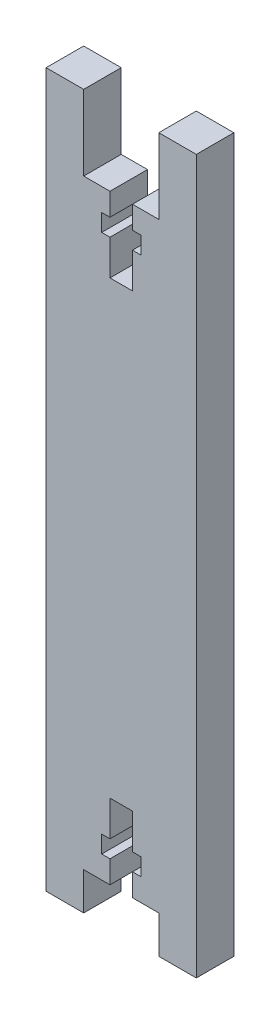
ISO-10303-21;
HEADER;
FILE_DESCRIPTION(('STEP AP214'),'2;1');
FILE_NAME('part.step','',(''),(''),'','','');
FILE_SCHEMA(('AUTOMOTIVE_DESIGN { 1 0 10303 214 1 1 1 1 }'));
ENDSEC;
DATA;
#1=APPLICATION_CONTEXT('core data for automotive mechanical design processes');
#2=APPLICATION_PROTOCOL_DEFINITION('international standard','automotive_design',2000,#1);
#3=PRODUCT_CONTEXT('',#1,'mechanical');
#4=PRODUCT('Part','Part','',(#3));
#5=PRODUCT_RELATED_PRODUCT_CATEGORY('part','',(#4));
#6=PRODUCT_DEFINITION_FORMATION('','',#4);
#7=PRODUCT_DEFINITION_CONTEXT('part definition',#1,'design');
#8=PRODUCT_DEFINITION('design','',#6,#7);
#9=PRODUCT_DEFINITION_SHAPE('','',#8);
#10=(LENGTH_UNIT() NAMED_UNIT(*) SI_UNIT(.MILLI.,.METRE.));
#11=(NAMED_UNIT(*) PLANE_ANGLE_UNIT() SI_UNIT($,.RADIAN.));
#12=(NAMED_UNIT(*) SI_UNIT($,.STERADIAN.) SOLID_ANGLE_UNIT());
#13=UNCERTAINTY_MEASURE_WITH_UNIT(LENGTH_MEASURE(1.E-05),#10,'distance_accuracy_value','');
#14=(GEOMETRIC_REPRESENTATION_CONTEXT(3) GLOBAL_UNCERTAINTY_ASSIGNED_CONTEXT((#13)) GLOBAL_UNIT_ASSIGNED_CONTEXT((#10,
#11,#12)) REPRESENTATION_CONTEXT('',''));
#15=CARTESIAN_POINT('',(0.,0.,0.));
#16=DIRECTION('',(0.,0.,1.));
#17=DIRECTION('',(1.,0.,0.));
#18=AXIS2_PLACEMENT_3D('',#15,#16,#17);
#19=CARTESIAN_POINT('',(-5.,-5.,5.));
#20=DIRECTION('',(0.,1.,0.));
#21=DIRECTION('',(-1.,0.,0.));
#22=AXIS2_PLACEMENT_3D('',#19,#20,#21);
#23=PLANE('',#22);
#24=DIRECTION('',(1.,0.,0.));
#25=VECTOR('',#24,1.);
#26=CARTESIAN_POINT('',(-5.,-5.,0.));
#27=LINE('',#26,#25);
#28=CARTESIAN_POINT('',(-10.,-5.,0.));
#29=VERTEX_POINT('',#28);
#30=CARTESIAN_POINT('',(-5.,-5.,0.));
#31=VERTEX_POINT('',#30);
#32=EDGE_CURVE('E297',#29,#31,#27,.T.);
#33=ORIENTED_EDGE('',*,*,#32,.T.);
#34=DIRECTION('',(0.,0.,-1.));
#35=VECTOR('',#34,1.);
#36=CARTESIAN_POINT('',(-5.,-5.,5.));
#37=LINE('',#36,#35);
#38=CARTESIAN_POINT('',(-5.,-5.,5.));
#39=VERTEX_POINT('',#38);
#40=EDGE_CURVE('E40',#39,#31,#37,.T.);
#41=ORIENTED_EDGE('',*,*,#40,.F.);
#42=DIRECTION('',(1.,0.,0.));
#43=VECTOR('',#42,1.);
#44=CARTESIAN_POINT('',(-5.,-5.,5.));
#45=LINE('',#44,#43);
#46=CARTESIAN_POINT('',(-10.,-5.,5.));
#47=VERTEX_POINT('',#46);
#48=EDGE_CURVE('E556',#47,#39,#45,.T.);
#49=ORIENTED_EDGE('',*,*,#48,.F.);
#50=DIRECTION('',(0.,0.,-1.));
#51=VECTOR('',#50,1.);
#52=CARTESIAN_POINT('',(-10.,-5.,5.));
#53=LINE('',#52,#51);
#54=EDGE_CURVE('E11',#47,#29,#53,.T.);
#55=ORIENTED_EDGE('',*,*,#54,.T.);
#56=EDGE_LOOP('',(#33,#41,#49,#55));
#57=FACE_BOUND('',#56,.T.);
#58=ADVANCED_FACE('F32',(#57),#23,.F.);
#59=CARTESIAN_POINT('',(-5.,-5.,5.));
#60=DIRECTION('',(-1.,0.,0.));
#61=DIRECTION('',(0.,0.,1.));
#62=AXIS2_PLACEMENT_3D('',#59,#60,#61);
#63=PLANE('',#62);
#64=DIRECTION('',(0.,1.,0.));
#65=VECTOR('',#64,1.);
#66=CARTESIAN_POINT('',(-5.,-5.,0.));
#67=LINE('',#66,#65);
#68=CARTESIAN_POINT('',(-5.,0.,0.));
#69=VERTEX_POINT('',#68);
#70=EDGE_CURVE('E299',#31,#69,#67,.T.);
#71=ORIENTED_EDGE('',*,*,#70,.T.);
#72=DIRECTION('',(0.,0.,-1.));
#73=VECTOR('',#72,1.);
#74=CARTESIAN_POINT('',(-5.,0.,5.));
#75=LINE('',#74,#73);
#76=CARTESIAN_POINT('',(-5.,0.,5.));
#77=VERTEX_POINT('',#76);
#78=EDGE_CURVE('E458',#77,#69,#75,.T.);
#79=ORIENTED_EDGE('',*,*,#78,.F.);
#80=DIRECTION('',(0.,1.,0.));
#81=VECTOR('',#80,1.);
#82=CARTESIAN_POINT('',(-5.,-5.,5.));
#83=LINE('',#82,#81);
#84=EDGE_CURVE('E467',#39,#77,#83,.T.);
#85=ORIENTED_EDGE('',*,*,#84,.F.);
#86=ORIENTED_EDGE('',*,*,#40,.T.);
#87=EDGE_LOOP('',(#71,#79,#85,#86));
#88=FACE_BOUND('',#87,.T.);
#89=ADVANCED_FACE('F465',(#88),#63,.F.);
#90=CARTESIAN_POINT('',(-1.5,0.,5.));
#91=DIRECTION('',(0.,1.,0.));
#92=DIRECTION('',(-1.,0.,0.));
#93=AXIS2_PLACEMENT_3D('',#90,#91,#92);
#94=PLANE('',#93);
#95=DIRECTION('',(1.,0.,0.));
#96=VECTOR('',#95,1.);
#97=CARTESIAN_POINT('',(-1.5,0.,0.));
#98=LINE('',#97,#96);
#99=CARTESIAN_POINT('',(-1.5,0.,0.));
#100=VERTEX_POINT('',#99);
#101=EDGE_CURVE('E301',#69,#100,#98,.T.);
#102=ORIENTED_EDGE('',*,*,#101,.T.);
#103=DIRECTION('',(0.,0.,-1.));
#104=VECTOR('',#103,1.);
#105=CARTESIAN_POINT('',(-1.5,0.,5.));
#106=LINE('',#105,#104);
#107=CARTESIAN_POINT('',(-1.5,0.,5.));
#108=VERTEX_POINT('',#107);
#109=EDGE_CURVE('E455',#108,#100,#106,.T.);
#110=ORIENTED_EDGE('',*,*,#109,.F.);
#111=DIRECTION('',(1.,0.,0.));
#112=VECTOR('',#111,1.);
#113=CARTESIAN_POINT('',(-1.5,0.,5.));
#114=LINE('',#113,#112);
#115=EDGE_CURVE('E485',#77,#108,#114,.T.);
#116=ORIENTED_EDGE('',*,*,#115,.F.);
#117=ORIENTED_EDGE('',*,*,#78,.T.);
#118=EDGE_LOOP('',(#102,#110,#116,#117));
#119=FACE_BOUND('',#118,.T.);
#120=ADVANCED_FACE('F476',(#119),#94,.F.);
#121=CARTESIAN_POINT('',(-1.5,2.99999999999998,5.));
#122=DIRECTION('',(-1.,0.,0.));
#123=DIRECTION('',(0.,0.,1.));
#124=AXIS2_PLACEMENT_3D('',#121,#122,#123);
#125=PLANE('',#124);
#126=DIRECTION('',(0.,1.,0.));
#127=VECTOR('',#126,1.);
#128=CARTESIAN_POINT('',(-1.5,2.99999999999998,0.));
#129=LINE('',#128,#127);
#130=CARTESIAN_POINT('',(-1.5,2.99999999999998,0.));
#131=VERTEX_POINT('',#130);
#132=EDGE_CURVE('E303',#100,#131,#129,.T.);
#133=ORIENTED_EDGE('',*,*,#132,.T.);
#134=DIRECTION('',(0.,0.,-1.));
#135=VECTOR('',#134,1.);
#136=CARTESIAN_POINT('',(-1.5,2.99999999999998,5.));
#137=LINE('',#136,#135);
#138=CARTESIAN_POINT('',(-1.5,2.99999999999998,5.));
#139=VERTEX_POINT('',#138);
#140=EDGE_CURVE('E452',#139,#131,#137,.T.);
#141=ORIENTED_EDGE('',*,*,#140,.F.);
#142=DIRECTION('',(0.,1.,0.));
#143=VECTOR('',#142,1.);
#144=CARTESIAN_POINT('',(-1.5,2.99999999999998,5.));
#145=LINE('',#144,#143);
#146=EDGE_CURVE('E482',#108,#139,#145,.T.);
#147=ORIENTED_EDGE('',*,*,#146,.F.);
#148=ORIENTED_EDGE('',*,*,#109,.T.);
#149=EDGE_LOOP('',(#133,#141,#147,#148));
#150=FACE_BOUND('',#149,.T.);
#151=ADVANCED_FACE('F480',(#150),#125,.F.);
#152=CARTESIAN_POINT('',(-1.5,2.99999999999998,5.));
#153=DIRECTION('',(0.,-1.,0.));
#154=DIRECTION('',(1.,0.,0.));
#155=AXIS2_PLACEMENT_3D('',#152,#153,#154);
#156=PLANE('',#155);
#157=DIRECTION('',(-1.,0.,0.));
#158=VECTOR('',#157,1.);
#159=CARTESIAN_POINT('',(-1.5,2.99999999999998,0.));
#160=LINE('',#159,#158);
#161=CARTESIAN_POINT('',(-2.6,2.99999999999998,0.));
#162=VERTEX_POINT('',#161);
#163=EDGE_CURVE('E305',#131,#162,#160,.T.);
#164=ORIENTED_EDGE('',*,*,#163,.T.);
#165=DIRECTION('',(0.,0.,-1.));
#166=VECTOR('',#165,1.);
#167=CARTESIAN_POINT('',(-2.6,2.99999999999998,5.));
#168=LINE('',#167,#166);
#169=CARTESIAN_POINT('',(-2.6,2.99999999999998,5.));
#170=VERTEX_POINT('',#169);
#171=EDGE_CURVE('E449',#170,#162,#168,.T.);
#172=ORIENTED_EDGE('',*,*,#171,.F.);
#173=DIRECTION('',(-1.,0.,0.));
#174=VECTOR('',#173,1.);
#175=CARTESIAN_POINT('',(-1.5,2.99999999999998,5.));
#176=LINE('',#175,#174);
#177=EDGE_CURVE('E484',#139,#170,#176,.T.);
#178=ORIENTED_EDGE('',*,*,#177,.F.);
#179=ORIENTED_EDGE('',*,*,#140,.T.);
#180=EDGE_LOOP('',(#164,#172,#178,#179));
#181=FACE_BOUND('',#180,.T.);
#182=ADVANCED_FACE('F570',(#181),#156,.F.);
#183=CARTESIAN_POINT('',(-2.6,2.99999999999998,5.));
#184=DIRECTION('',(-1.,0.,0.));
#185=DIRECTION('',(0.,-1.,0.));
#186=AXIS2_PLACEMENT_3D('',#183,#184,#185);
#187=PLANE('',#186);
#188=DIRECTION('',(0.,1.,0.));
#189=VECTOR('',#188,1.);
#190=CARTESIAN_POINT('',(-2.6,2.99999999999998,0.));
#191=LINE('',#190,#189);
#192=CARTESIAN_POINT('',(-2.6,5.29999999999998,0.));
#193=VERTEX_POINT('',#192);
#194=EDGE_CURVE('E307',#162,#193,#191,.T.);
#195=ORIENTED_EDGE('',*,*,#194,.T.);
#196=DIRECTION('',(0.,0.,-1.));
#197=VECTOR('',#196,1.);
#198=CARTESIAN_POINT('',(-2.6,5.29999999999998,5.));
#199=LINE('',#198,#197);
#200=CARTESIAN_POINT('',(-2.6,5.29999999999998,5.));
#201=VERTEX_POINT('',#200);
#202=EDGE_CURVE('E446',#201,#193,#199,.T.);
#203=ORIENTED_EDGE('',*,*,#202,.F.);
#204=DIRECTION('',(0.,1.,0.));
#205=VECTOR('',#204,1.);
#206=CARTESIAN_POINT('',(-2.6,2.99999999999998,5.));
#207=LINE('',#206,#205);
#208=EDGE_CURVE('E487',#170,#201,#207,.T.);
#209=ORIENTED_EDGE('',*,*,#208,.F.);
#210=ORIENTED_EDGE('',*,*,#171,.T.);
#211=EDGE_LOOP('',(#195,#203,#209,#210));
#212=FACE_BOUND('',#211,.T.);
#213=ADVANCED_FACE('F573',(#212),#187,.F.);
#214=CARTESIAN_POINT('',(-2.6,5.29999999999998,5.));
#215=DIRECTION('',(0.,1.,0.));
#216=DIRECTION('',(-1.,0.,0.));
#217=AXIS2_PLACEMENT_3D('',#214,#215,#216);
#218=PLANE('',#217);
#219=DIRECTION('',(1.,0.,0.));
#220=VECTOR('',#219,1.);
#221=CARTESIAN_POINT('',(-2.6,5.29999999999998,0.));
#222=LINE('',#221,#220);
#223=CARTESIAN_POINT('',(-1.5,5.29999999999997,0.));
#224=VERTEX_POINT('',#223);
#225=EDGE_CURVE('E309',#193,#224,#222,.T.);
#226=ORIENTED_EDGE('',*,*,#225,.T.);
#227=DIRECTION('',(0.,0.,-1.));
#228=VECTOR('',#227,1.);
#229=CARTESIAN_POINT('',(-1.5,5.29999999999997,5.));
#230=LINE('',#229,#228);
#231=CARTESIAN_POINT('',(-1.5,5.29999999999997,5.));
#232=VERTEX_POINT('',#231);
#233=EDGE_CURVE('E443',#232,#224,#230,.T.);
#234=ORIENTED_EDGE('',*,*,#233,.F.);
#235=DIRECTION('',(1.,0.,0.));
#236=VECTOR('',#235,1.);
#237=CARTESIAN_POINT('',(-2.6,5.29999999999998,5.));
#238=LINE('',#237,#236);
#239=EDGE_CURVE('E493',#201,#232,#238,.T.);
#240=ORIENTED_EDGE('',*,*,#239,.F.);
#241=ORIENTED_EDGE('',*,*,#202,.T.);
#242=EDGE_LOOP('',(#226,#234,#240,#241));
#243=FACE_BOUND('',#242,.T.);
#244=ADVANCED_FACE('F577',(#243),#218,.F.);
#245=CARTESIAN_POINT('',(-1.5,9.99999999999998,5.));
#246=DIRECTION('',(-1.,0.,0.));
#247=DIRECTION('',(0.,-1.,0.));
#248=AXIS2_PLACEMENT_3D('',#245,#246,#247);
#249=PLANE('',#248);
#250=DIRECTION('',(0.,1.,0.));
#251=VECTOR('',#250,1.);
#252=CARTESIAN_POINT('',(-1.5,9.99999999999998,0.));
#253=LINE('',#252,#251);
#254=CARTESIAN_POINT('',(-1.5,9.99999999999998,0.));
#255=VERTEX_POINT('',#254);
#256=EDGE_CURVE('E311',#224,#255,#253,.T.);
#257=ORIENTED_EDGE('',*,*,#256,.T.);
#258=DIRECTION('',(0.,0.,-1.));
#259=VECTOR('',#258,1.);
#260=CARTESIAN_POINT('',(-1.5,9.99999999999998,5.));
#261=LINE('',#260,#259);
#262=CARTESIAN_POINT('',(-1.5,9.99999999999998,5.));
#263=VERTEX_POINT('',#262);
#264=EDGE_CURVE('E440',#263,#255,#261,.T.);
#265=ORIENTED_EDGE('',*,*,#264,.F.);
#266=DIRECTION('',(0.,1.,0.));
#267=VECTOR('',#266,1.);
#268=CARTESIAN_POINT('',(-1.5,9.99999999999998,5.));
#269=LINE('',#268,#267);
#270=EDGE_CURVE('E495',#232,#263,#269,.T.);
#271=ORIENTED_EDGE('',*,*,#270,.F.);
#272=ORIENTED_EDGE('',*,*,#233,.T.);
#273=EDGE_LOOP('',(#257,#265,#271,#272));
#274=FACE_BOUND('',#273,.T.);
#275=ADVANCED_FACE('F581',(#274),#249,.F.);
#276=CARTESIAN_POINT('',(1.5,9.99999999999998,5.));
#277=DIRECTION('',(0.,1.,0.));
#278=DIRECTION('',(0.,0.,1.));
#279=AXIS2_PLACEMENT_3D('',#276,#277,#278);
#280=PLANE('',#279);
#281=DIRECTION('',(1.,0.,0.));
#282=VECTOR('',#281,1.);
#283=CARTESIAN_POINT('',(1.5,9.99999999999998,0.));
#284=LINE('',#283,#282);
#285=CARTESIAN_POINT('',(1.5,9.99999999999998,0.));
#286=VERTEX_POINT('',#285);
#287=EDGE_CURVE('E313',#255,#286,#284,.T.);
#288=ORIENTED_EDGE('',*,*,#287,.T.);
#289=DIRECTION('',(0.,0.,-1.));
#290=VECTOR('',#289,1.);
#291=CARTESIAN_POINT('',(1.5,9.99999999999998,5.));
#292=LINE('',#291,#290);
#293=CARTESIAN_POINT('',(1.5,9.99999999999998,5.));
#294=VERTEX_POINT('',#293);
#295=EDGE_CURVE('E437',#294,#286,#292,.T.);
#296=ORIENTED_EDGE('',*,*,#295,.F.);
#297=DIRECTION('',(1.,0.,0.));
#298=VECTOR('',#297,1.);
#299=CARTESIAN_POINT('',(1.5,9.99999999999998,5.));
#300=LINE('',#299,#298);
#301=EDGE_CURVE('E497',#263,#294,#300,.T.);
#302=ORIENTED_EDGE('',*,*,#301,.F.);
#303=ORIENTED_EDGE('',*,*,#264,.T.);
#304=EDGE_LOOP('',(#288,#296,#302,#303));
#305=FACE_BOUND('',#304,.T.);
#306=ADVANCED_FACE('F585',(#305),#280,.F.);
#307=CARTESIAN_POINT('',(1.5,5.29999999999997,5.));
#308=DIRECTION('',(1.,0.,0.));
#309=DIRECTION('',(0.,1.,0.));
#310=AXIS2_PLACEMENT_3D('',#307,#308,#309);
#311=PLANE('',#310);
#312=DIRECTION('',(0.,-1.,0.));
#313=VECTOR('',#312,1.);
#314=CARTESIAN_POINT('',(1.5,5.29999999999997,0.));
#315=LINE('',#314,#313);
#316=CARTESIAN_POINT('',(1.5,5.29999999999997,0.));
#317=VERTEX_POINT('',#316);
#318=EDGE_CURVE('E315',#286,#317,#315,.T.);
#319=ORIENTED_EDGE('',*,*,#318,.T.);
#320=DIRECTION('',(0.,0.,-1.));
#321=VECTOR('',#320,1.);
#322=CARTESIAN_POINT('',(1.5,5.29999999999997,5.));
#323=LINE('',#322,#321);
#324=CARTESIAN_POINT('',(1.5,5.29999999999997,5.));
#325=VERTEX_POINT('',#324);
#326=EDGE_CURVE('E434',#325,#317,#323,.T.);
#327=ORIENTED_EDGE('',*,*,#326,.F.);
#328=DIRECTION('',(0.,-1.,0.));
#329=VECTOR('',#328,1.);
#330=CARTESIAN_POINT('',(1.5,5.29999999999997,5.));
#331=LINE('',#330,#329);
#332=EDGE_CURVE('E499',#294,#325,#331,.T.);
#333=ORIENTED_EDGE('',*,*,#332,.F.);
#334=ORIENTED_EDGE('',*,*,#295,.T.);
#335=EDGE_LOOP('',(#319,#327,#333,#334));
#336=FACE_BOUND('',#335,.T.);
#337=ADVANCED_FACE('F589',(#336),#311,.F.);
#338=CARTESIAN_POINT('',(1.5,5.29999999999997,5.));
#339=DIRECTION('',(0.,1.,0.));
#340=DIRECTION('',(-1.,0.,0.));
#341=AXIS2_PLACEMENT_3D('',#338,#339,#340);
#342=PLANE('',#341);
#343=DIRECTION('',(1.,0.,0.));
#344=VECTOR('',#343,1.);
#345=CARTESIAN_POINT('',(1.5,5.29999999999997,0.));
#346=LINE('',#345,#344);
#347=CARTESIAN_POINT('',(2.6,5.29999999999998,0.));
#348=VERTEX_POINT('',#347);
#349=EDGE_CURVE('E317',#317,#348,#346,.T.);
#350=ORIENTED_EDGE('',*,*,#349,.T.);
#351=DIRECTION('',(0.,0.,-1.));
#352=VECTOR('',#351,1.);
#353=CARTESIAN_POINT('',(2.6,5.29999999999998,5.));
#354=LINE('',#353,#352);
#355=CARTESIAN_POINT('',(2.6,5.29999999999998,5.));
#356=VERTEX_POINT('',#355);
#357=EDGE_CURVE('E431',#356,#348,#354,.T.);
#358=ORIENTED_EDGE('',*,*,#357,.F.);
#359=DIRECTION('',(1.,0.,0.));
#360=VECTOR('',#359,1.);
#361=CARTESIAN_POINT('',(1.5,5.29999999999997,5.));
#362=LINE('',#361,#360);
#363=EDGE_CURVE('E501',#325,#356,#362,.T.);
#364=ORIENTED_EDGE('',*,*,#363,.F.);
#365=ORIENTED_EDGE('',*,*,#326,.T.);
#366=EDGE_LOOP('',(#350,#358,#364,#365));
#367=FACE_BOUND('',#366,.T.);
#368=ADVANCED_FACE('F593',(#367),#342,.F.);
#369=CARTESIAN_POINT('',(2.6,5.29999999999998,5.));
#370=DIRECTION('',(1.,0.,0.));
#371=DIRECTION('',(0.,1.,0.));
#372=AXIS2_PLACEMENT_3D('',#369,#370,#371);
#373=PLANE('',#372);
#374=DIRECTION('',(0.,-1.,0.));
#375=VECTOR('',#374,1.);
#376=CARTESIAN_POINT('',(2.6,5.29999999999998,0.));
#377=LINE('',#376,#375);
#378=CARTESIAN_POINT('',(2.6,2.99999999999998,0.));
#379=VERTEX_POINT('',#378);
#380=EDGE_CURVE('E319',#348,#379,#377,.T.);
#381=ORIENTED_EDGE('',*,*,#380,.T.);
#382=DIRECTION('',(0.,0.,-1.));
#383=VECTOR('',#382,1.);
#384=CARTESIAN_POINT('',(2.6,2.99999999999998,5.));
#385=LINE('',#384,#383);
#386=CARTESIAN_POINT('',(2.6,2.99999999999998,5.));
#387=VERTEX_POINT('',#386);
#388=EDGE_CURVE('E428',#387,#379,#385,.T.);
#389=ORIENTED_EDGE('',*,*,#388,.F.);
#390=DIRECTION('',(0.,-1.,0.));
#391=VECTOR('',#390,1.);
#392=CARTESIAN_POINT('',(2.6,5.29999999999998,5.));
#393=LINE('',#392,#391);
#394=EDGE_CURVE('E503',#356,#387,#393,.T.);
#395=ORIENTED_EDGE('',*,*,#394,.F.);
#396=ORIENTED_EDGE('',*,*,#357,.T.);
#397=EDGE_LOOP('',(#381,#389,#395,#396));
#398=FACE_BOUND('',#397,.T.);
#399=ADVANCED_FACE('F597',(#398),#373,.F.);
#400=CARTESIAN_POINT('',(2.6,2.99999999999998,5.));
#401=DIRECTION('',(0.,-1.,0.));
#402=DIRECTION('',(1.,0.,0.));
#403=AXIS2_PLACEMENT_3D('',#400,#401,#402);
#404=PLANE('',#403);
#405=DIRECTION('',(-1.,0.,0.));
#406=VECTOR('',#405,1.);
#407=CARTESIAN_POINT('',(2.6,2.99999999999998,0.));
#408=LINE('',#407,#406);
#409=CARTESIAN_POINT('',(1.5,2.99999999999998,0.));
#410=VERTEX_POINT('',#409);
#411=EDGE_CURVE('E321',#379,#410,#408,.T.);
#412=ORIENTED_EDGE('',*,*,#411,.T.);
#413=DIRECTION('',(0.,0.,-1.));
#414=VECTOR('',#413,1.);
#415=CARTESIAN_POINT('',(1.5,2.99999999999998,5.));
#416=LINE('',#415,#414);
#417=CARTESIAN_POINT('',(1.5,2.99999999999998,5.));
#418=VERTEX_POINT('',#417);
#419=EDGE_CURVE('E425',#418,#410,#416,.T.);
#420=ORIENTED_EDGE('',*,*,#419,.F.);
#421=DIRECTION('',(-1.,0.,0.));
#422=VECTOR('',#421,1.);
#423=CARTESIAN_POINT('',(2.6,2.99999999999998,5.));
#424=LINE('',#423,#422);
#425=EDGE_CURVE('E505',#387,#418,#424,.T.);
#426=ORIENTED_EDGE('',*,*,#425,.F.);
#427=ORIENTED_EDGE('',*,*,#388,.T.);
#428=EDGE_LOOP('',(#412,#420,#426,#427));
#429=FACE_BOUND('',#428,.T.);
#430=ADVANCED_FACE('F601',(#429),#404,.F.);
#431=CARTESIAN_POINT('',(1.5,0.,5.));
#432=DIRECTION('',(1.,0.,0.));
#433=DIRECTION('',(0.,0.,-1.));
#434=AXIS2_PLACEMENT_3D('',#431,#432,#433);
#435=PLANE('',#434);
#436=DIRECTION('',(0.,-1.,0.));
#437=VECTOR('',#436,1.);
#438=CARTESIAN_POINT('',(1.5,0.,0.));
#439=LINE('',#438,#437);
#440=CARTESIAN_POINT('',(1.5,0.,0.));
#441=VERTEX_POINT('',#440);
#442=EDGE_CURVE('E323',#410,#441,#439,.T.);
#443=ORIENTED_EDGE('',*,*,#442,.T.);
#444=DIRECTION('',(0.,0.,-1.));
#445=VECTOR('',#444,1.);
#446=CARTESIAN_POINT('',(1.5,0.,5.));
#447=LINE('',#446,#445);
#448=CARTESIAN_POINT('',(1.5,0.,5.));
#449=VERTEX_POINT('',#448);
#450=EDGE_CURVE('E422',#449,#441,#447,.T.);
#451=ORIENTED_EDGE('',*,*,#450,.F.);
#452=DIRECTION('',(0.,-1.,0.));
#453=VECTOR('',#452,1.);
#454=CARTESIAN_POINT('',(1.5,0.,5.));
#455=LINE('',#454,#453);
#456=EDGE_CURVE('E507',#418,#449,#455,.T.);
#457=ORIENTED_EDGE('',*,*,#456,.F.);
#458=ORIENTED_EDGE('',*,*,#419,.T.);
#459=EDGE_LOOP('',(#443,#451,#457,#458));
#460=FACE_BOUND('',#459,.T.);
#461=ADVANCED_FACE('F605',(#460),#435,.F.);
#462=CARTESIAN_POINT('',(1.5,0.,5.));
#463=DIRECTION('',(0.,1.,0.));
#464=DIRECTION('',(-1.,0.,0.));
#465=AXIS2_PLACEMENT_3D('',#462,#463,#464);
#466=PLANE('',#465);
#467=DIRECTION('',(1.,0.,0.));
#468=VECTOR('',#467,1.);
#469=CARTESIAN_POINT('',(1.5,0.,0.));
#470=LINE('',#469,#468);
#471=CARTESIAN_POINT('',(5.,0.,0.));
#472=VERTEX_POINT('',#471);
#473=EDGE_CURVE('E325',#441,#472,#470,.T.);
#474=ORIENTED_EDGE('',*,*,#473,.T.);
#475=DIRECTION('',(0.,0.,-1.));
#476=VECTOR('',#475,1.);
#477=CARTESIAN_POINT('',(5.,0.,5.));
#478=LINE('',#477,#476);
#479=CARTESIAN_POINT('',(5.,0.,5.));
#480=VERTEX_POINT('',#479);
#481=EDGE_CURVE('E419',#480,#472,#478,.T.);
#482=ORIENTED_EDGE('',*,*,#481,.F.);
#483=DIRECTION('',(1.,0.,0.));
#484=VECTOR('',#483,1.);
#485=CARTESIAN_POINT('',(1.5,0.,5.));
#486=LINE('',#485,#484);
#487=EDGE_CURVE('E509',#449,#480,#486,.T.);
#488=ORIENTED_EDGE('',*,*,#487,.F.);
#489=ORIENTED_EDGE('',*,*,#450,.T.);
#490=EDGE_LOOP('',(#474,#482,#488,#489));
#491=FACE_BOUND('',#490,.T.);
#492=ADVANCED_FACE('F609',(#491),#466,.F.);
#493=CARTESIAN_POINT('',(5.,0.,5.));
#494=DIRECTION('',(1.,0.,0.));
#495=DIRECTION('',(0.,1.,0.));
#496=AXIS2_PLACEMENT_3D('',#493,#494,#495);
#497=PLANE('',#496);
#498=DIRECTION('',(0.,-1.,0.));
#499=VECTOR('',#498,1.);
#500=CARTESIAN_POINT('',(5.,0.,0.));
#501=LINE('',#500,#499);
#502=CARTESIAN_POINT('',(5.,-5.,0.));
#503=VERTEX_POINT('',#502);
#504=EDGE_CURVE('E327',#472,#503,#501,.T.);
#505=ORIENTED_EDGE('',*,*,#504,.T.);
#506=DIRECTION('',(0.,0.,-1.));
#507=VECTOR('',#506,1.);
#508=CARTESIAN_POINT('',(5.,-5.,5.));
#509=LINE('',#508,#507);
#510=CARTESIAN_POINT('',(5.,-5.,5.));
#511=VERTEX_POINT('',#510);
#512=EDGE_CURVE('E416',#511,#503,#509,.T.);
#513=ORIENTED_EDGE('',*,*,#512,.F.);
#514=DIRECTION('',(0.,-1.,0.));
#515=VECTOR('',#514,1.);
#516=CARTESIAN_POINT('',(5.,0.,5.));
#517=LINE('',#516,#515);
#518=EDGE_CURVE('E511',#480,#511,#517,.T.);
#519=ORIENTED_EDGE('',*,*,#518,.F.);
#520=ORIENTED_EDGE('',*,*,#481,.T.);
#521=EDGE_LOOP('',(#505,#513,#519,#520));
#522=FACE_BOUND('',#521,.T.);
#523=ADVANCED_FACE('F613',(#522),#497,.F.);
#524=CARTESIAN_POINT('',(5.,-5.,5.));
#525=DIRECTION('',(0.,1.,0.));
#526=DIRECTION('',(0.,0.,1.));
#527=AXIS2_PLACEMENT_3D('',#524,#525,#526);
#528=PLANE('',#527);
#529=DIRECTION('',(1.,0.,0.));
#530=VECTOR('',#529,1.);
#531=CARTESIAN_POINT('',(5.,-5.,0.));
#532=LINE('',#531,#530);
#533=CARTESIAN_POINT('',(10.,-5.,0.));
#534=VERTEX_POINT('',#533);
#535=EDGE_CURVE('E329',#503,#534,#532,.T.);
#536=ORIENTED_EDGE('',*,*,#535,.T.);
#537=DIRECTION('',(0.,0.,-1.));
#538=VECTOR('',#537,1.);
#539=CARTESIAN_POINT('',(10.,-5.,5.));
#540=LINE('',#539,#538);
#541=CARTESIAN_POINT('',(10.,-5.,5.));
#542=VERTEX_POINT('',#541);
#543=EDGE_CURVE('E413',#542,#534,#540,.T.);
#544=ORIENTED_EDGE('',*,*,#543,.F.);
#545=DIRECTION('',(1.,0.,0.));
#546=VECTOR('',#545,1.);
#547=CARTESIAN_POINT('',(5.,-5.,5.));
#548=LINE('',#547,#546);
#549=EDGE_CURVE('E513',#511,#542,#548,.T.);
#550=ORIENTED_EDGE('',*,*,#549,.F.);
#551=ORIENTED_EDGE('',*,*,#512,.T.);
#552=EDGE_LOOP('',(#536,#544,#550,#551));
#553=FACE_BOUND('',#552,.T.);
#554=ADVANCED_FACE('F617',(#553),#528,.F.);
#555=CARTESIAN_POINT('',(9.99999999999998,90.,5.));
#556=DIRECTION('',(-1.,0.,0.));
#557=DIRECTION('',(0.,-1.,0.));
#558=AXIS2_PLACEMENT_3D('',#555,#556,#557);
#559=PLANE('',#558);
#560=DIRECTION('',(0.,1.,0.));
#561=VECTOR('',#560,1.);
#562=CARTESIAN_POINT('',(9.99999999999998,90.,0.));
#563=LINE('',#562,#561);
#564=CARTESIAN_POINT('',(9.99999999999998,90.,0.));
#565=VERTEX_POINT('',#564);
#566=EDGE_CURVE('E332',#534,#565,#563,.T.);
#567=ORIENTED_EDGE('',*,*,#566,.T.);
#568=DIRECTION('',(0.,0.,-1.));
#569=VECTOR('',#568,1.);
#570=CARTESIAN_POINT('',(9.99999999999998,90.,5.));
#571=LINE('',#570,#569);
#572=CARTESIAN_POINT('',(9.99999999999998,90.,5.));
#573=VERTEX_POINT('',#572);
#574=EDGE_CURVE('E410',#573,#565,#571,.T.);
#575=ORIENTED_EDGE('',*,*,#574,.F.);
#576=DIRECTION('',(0.,1.,0.));
#577=VECTOR('',#576,1.);
#578=CARTESIAN_POINT('',(10.,-5.,5.));
#579=LINE('',#578,#577);
#580=EDGE_CURVE('E515',#542,#573,#579,.T.);
#581=ORIENTED_EDGE('',*,*,#580,.F.);
#582=ORIENTED_EDGE('',*,*,#543,.T.);
#583=EDGE_LOOP('',(#567,#575,#581,#582));
#584=FACE_BOUND('',#583,.T.);
#585=ADVANCED_FACE('F621',(#584),#559,.F.);
#586=CARTESIAN_POINT('',(4.99999999999998,90.,5.));
#587=DIRECTION('',(0.,-1.,0.));
#588=DIRECTION('',(0.,0.,-1.));
#589=AXIS2_PLACEMENT_3D('',#586,#587,#588);
#590=PLANE('',#589);
#591=DIRECTION('',(-1.,0.,0.));
#592=VECTOR('',#591,1.);
#593=CARTESIAN_POINT('',(4.99999999999998,90.,0.));
#594=LINE('',#593,#592);
#595=CARTESIAN_POINT('',(4.99999999999998,90.,0.));
#596=VERTEX_POINT('',#595);
#597=EDGE_CURVE('E334',#565,#596,#594,.T.);
#598=ORIENTED_EDGE('',*,*,#597,.T.);
#599=DIRECTION('',(0.,0.,-1.));
#600=VECTOR('',#599,1.);
#601=CARTESIAN_POINT('',(4.99999999999998,90.,5.));
#602=LINE('',#601,#600);
#603=CARTESIAN_POINT('',(4.99999999999998,90.,5.));
#604=VERTEX_POINT('',#603);
#605=EDGE_CURVE('E407',#604,#596,#602,.T.);
#606=ORIENTED_EDGE('',*,*,#605,.F.);
#607=DIRECTION('',(-1.,0.,0.));
#608=VECTOR('',#607,1.);
#609=CARTESIAN_POINT('',(4.99999999999998,90.,5.));
#610=LINE('',#609,#608);
#611=EDGE_CURVE('E517',#573,#604,#610,.T.);
#612=ORIENTED_EDGE('',*,*,#611,.F.);
#613=ORIENTED_EDGE('',*,*,#574,.T.);
#614=EDGE_LOOP('',(#598,#606,#612,#613));
#615=FACE_BOUND('',#614,.T.);
#616=ADVANCED_FACE('F625',(#615),#590,.F.);
#617=CARTESIAN_POINT('',(5.,80.,5.));
#618=DIRECTION('',(1.,0.,0.));
#619=DIRECTION('',(0.,1.,0.));
#620=AXIS2_PLACEMENT_3D('',#617,#618,#619);
#621=PLANE('',#620);
#622=DIRECTION('',(0.,-1.,0.));
#623=VECTOR('',#622,1.);
#624=CARTESIAN_POINT('',(5.,80.,0.));
#625=LINE('',#624,#623);
#626=CARTESIAN_POINT('',(5.,80.,0.));
#627=VERTEX_POINT('',#626);
#628=EDGE_CURVE('E337',#596,#627,#625,.T.);
#629=ORIENTED_EDGE('',*,*,#628,.T.);
#630=DIRECTION('',(0.,0.,-1.));
#631=VECTOR('',#630,1.);
#632=CARTESIAN_POINT('',(5.,80.,5.));
#633=LINE('',#632,#631);
#634=CARTESIAN_POINT('',(5.,80.,5.));
#635=VERTEX_POINT('',#634);
#636=EDGE_CURVE('E404',#635,#627,#633,.T.);
#637=ORIENTED_EDGE('',*,*,#636,.F.);
#638=DIRECTION('',(0.,-1.,0.));
#639=VECTOR('',#638,1.);
#640=CARTESIAN_POINT('',(5.,85.,5.));
#641=LINE('',#640,#639);
#642=EDGE_CURVE('E519',#604,#635,#641,.T.);
#643=ORIENTED_EDGE('',*,*,#642,.F.);
#644=ORIENTED_EDGE('',*,*,#605,.T.);
#645=EDGE_LOOP('',(#629,#637,#643,#644));
#646=FACE_BOUND('',#645,.T.);
#647=ADVANCED_FACE('F629',(#646),#621,.F.);
#648=CARTESIAN_POINT('',(1.5,80.,5.));
#649=DIRECTION('',(0.,-1.,0.));
#650=DIRECTION('',(0.,0.,-1.));
#651=AXIS2_PLACEMENT_3D('',#648,#649,#650);
#652=PLANE('',#651);
#653=DIRECTION('',(-1.,0.,0.));
#654=VECTOR('',#653,1.);
#655=CARTESIAN_POINT('',(1.5,80.,0.));
#656=LINE('',#655,#654);
#657=CARTESIAN_POINT('',(1.5,80.,0.));
#658=VERTEX_POINT('',#657);
#659=EDGE_CURVE('E339',#627,#658,#656,.T.);
#660=ORIENTED_EDGE('',*,*,#659,.T.);
#661=DIRECTION('',(0.,0.,-1.));
#662=VECTOR('',#661,1.);
#663=CARTESIAN_POINT('',(1.5,80.,5.));
#664=LINE('',#663,#662);
#665=CARTESIAN_POINT('',(1.5,80.,5.));
#666=VERTEX_POINT('',#665);
#667=EDGE_CURVE('E401',#666,#658,#664,.T.);
#668=ORIENTED_EDGE('',*,*,#667,.F.);
#669=DIRECTION('',(-1.,0.,0.));
#670=VECTOR('',#669,1.);
#671=CARTESIAN_POINT('',(1.5,80.,5.));
#672=LINE('',#671,#670);
#673=EDGE_CURVE('E521',#635,#666,#672,.T.);
#674=ORIENTED_EDGE('',*,*,#673,.F.);
#675=ORIENTED_EDGE('',*,*,#636,.T.);
#676=EDGE_LOOP('',(#660,#668,#674,#675));
#677=FACE_BOUND('',#676,.T.);
#678=ADVANCED_FACE('F633',(#677),#652,.F.);
#679=CARTESIAN_POINT('',(1.5,80.,5.));
#680=DIRECTION('',(1.,0.,0.));
#681=DIRECTION('',(0.,1.,0.));
#682=AXIS2_PLACEMENT_3D('',#679,#680,#681);
#683=PLANE('',#682);
#684=DIRECTION('',(0.,-1.,0.));
#685=VECTOR('',#684,1.);
#686=CARTESIAN_POINT('',(1.5,80.,0.));
#687=LINE('',#686,#685);
#688=CARTESIAN_POINT('',(1.5,77.,0.));
#689=VERTEX_POINT('',#688);
#690=EDGE_CURVE('E341',#658,#689,#687,.T.);
#691=ORIENTED_EDGE('',*,*,#690,.T.);
#692=DIRECTION('',(0.,0.,-1.));
#693=VECTOR('',#692,1.);
#694=CARTESIAN_POINT('',(1.5,77.,5.));
#695=LINE('',#694,#693);
#696=CARTESIAN_POINT('',(1.5,77.,5.));
#697=VERTEX_POINT('',#696);
#698=EDGE_CURVE('E398',#697,#689,#695,.T.);
#699=ORIENTED_EDGE('',*,*,#698,.F.);
#700=DIRECTION('',(0.,-1.,0.));
#701=VECTOR('',#700,1.);
#702=CARTESIAN_POINT('',(1.5,80.,5.));
#703=LINE('',#702,#701);
#704=EDGE_CURVE('E523',#666,#697,#703,.T.);
#705=ORIENTED_EDGE('',*,*,#704,.F.);
#706=ORIENTED_EDGE('',*,*,#667,.T.);
#707=EDGE_LOOP('',(#691,#699,#705,#706));
#708=FACE_BOUND('',#707,.T.);
#709=ADVANCED_FACE('F637',(#708),#683,.F.);
#710=CARTESIAN_POINT('',(2.59999999999998,77.,5.));
#711=DIRECTION('',(0.,1.,0.));
#712=DIRECTION('',(0.,0.,1.));
#713=AXIS2_PLACEMENT_3D('',#710,#711,#712);
#714=PLANE('',#713);
#715=DIRECTION('',(1.,0.,0.));
#716=VECTOR('',#715,1.);
#717=CARTESIAN_POINT('',(2.59999999999998,77.,0.));
#718=LINE('',#717,#716);
#719=CARTESIAN_POINT('',(2.59999999999998,77.,0.));
#720=VERTEX_POINT('',#719);
#721=EDGE_CURVE('E343',#689,#720,#718,.T.);
#722=ORIENTED_EDGE('',*,*,#721,.T.);
#723=DIRECTION('',(0.,0.,-1.));
#724=VECTOR('',#723,1.);
#725=CARTESIAN_POINT('',(2.59999999999998,77.,5.));
#726=LINE('',#725,#724);
#727=CARTESIAN_POINT('',(2.59999999999998,77.,5.));
#728=VERTEX_POINT('',#727);
#729=EDGE_CURVE('E395',#728,#720,#726,.T.);
#730=ORIENTED_EDGE('',*,*,#729,.F.);
#731=DIRECTION('',(1.,0.,0.));
#732=VECTOR('',#731,1.);
#733=CARTESIAN_POINT('',(2.59999999999998,77.,5.));
#734=LINE('',#733,#732);
#735=EDGE_CURVE('E525',#697,#728,#734,.T.);
#736=ORIENTED_EDGE('',*,*,#735,.F.);
#737=ORIENTED_EDGE('',*,*,#698,.T.);
#738=EDGE_LOOP('',(#722,#730,#736,#737));
#739=FACE_BOUND('',#738,.T.);
#740=ADVANCED_FACE('F641',(#739),#714,.F.);
#741=CARTESIAN_POINT('',(2.59999999999999,74.7,5.));
#742=DIRECTION('',(1.,0.,0.));
#743=DIRECTION('',(0.,1.,0.));
#744=AXIS2_PLACEMENT_3D('',#741,#742,#743);
#745=PLANE('',#744);
#746=DIRECTION('',(0.,-1.,0.));
#747=VECTOR('',#746,1.);
#748=CARTESIAN_POINT('',(2.59999999999999,74.7,0.));
#749=LINE('',#748,#747);
#750=CARTESIAN_POINT('',(2.59999999999999,74.7,0.));
#751=VERTEX_POINT('',#750);
#752=EDGE_CURVE('E345',#720,#751,#749,.T.);
#753=ORIENTED_EDGE('',*,*,#752,.T.);
#754=DIRECTION('',(0.,0.,-1.));
#755=VECTOR('',#754,1.);
#756=CARTESIAN_POINT('',(2.59999999999999,74.7,5.));
#757=LINE('',#756,#755);
#758=CARTESIAN_POINT('',(2.59999999999999,74.7,5.));
#759=VERTEX_POINT('',#758);
#760=EDGE_CURVE('E392',#759,#751,#757,.T.);
#761=ORIENTED_EDGE('',*,*,#760,.F.);
#762=DIRECTION('',(0.,-1.,0.));
#763=VECTOR('',#762,1.);
#764=CARTESIAN_POINT('',(2.59999999999999,74.7,5.));
#765=LINE('',#764,#763);
#766=EDGE_CURVE('E527',#728,#759,#765,.T.);
#767=ORIENTED_EDGE('',*,*,#766,.F.);
#768=ORIENTED_EDGE('',*,*,#729,.T.);
#769=EDGE_LOOP('',(#753,#761,#767,#768));
#770=FACE_BOUND('',#769,.T.);
#771=ADVANCED_FACE('F645',(#770),#745,.F.);
#772=CARTESIAN_POINT('',(1.5,74.7,5.));
#773=DIRECTION('',(0.,-1.,0.));
#774=DIRECTION('',(0.,0.,-1.));
#775=AXIS2_PLACEMENT_3D('',#772,#773,#774);
#776=PLANE('',#775);
#777=DIRECTION('',(-1.,0.,0.));
#778=VECTOR('',#777,1.);
#779=CARTESIAN_POINT('',(1.5,74.7,0.));
#780=LINE('',#779,#778);
#781=CARTESIAN_POINT('',(1.5,74.7,0.));
#782=VERTEX_POINT('',#781);
#783=EDGE_CURVE('E347',#751,#782,#780,.T.);
#784=ORIENTED_EDGE('',*,*,#783,.T.);
#785=DIRECTION('',(0.,0.,-1.));
#786=VECTOR('',#785,1.);
#787=CARTESIAN_POINT('',(1.5,74.7,5.));
#788=LINE('',#787,#786);
#789=CARTESIAN_POINT('',(1.5,74.7,5.));
#790=VERTEX_POINT('',#789);
#791=EDGE_CURVE('E389',#790,#782,#788,.T.);
#792=ORIENTED_EDGE('',*,*,#791,.F.);
#793=DIRECTION('',(-1.,0.,0.));
#794=VECTOR('',#793,1.);
#795=CARTESIAN_POINT('',(1.5,74.7,5.));
#796=LINE('',#795,#794);
#797=EDGE_CURVE('E529',#759,#790,#796,.T.);
#798=ORIENTED_EDGE('',*,*,#797,.F.);
#799=ORIENTED_EDGE('',*,*,#760,.T.);
#800=EDGE_LOOP('',(#784,#792,#798,#799));
#801=FACE_BOUND('',#800,.T.);
#802=ADVANCED_FACE('F649',(#801),#776,.F.);
#803=CARTESIAN_POINT('',(1.5,74.7,5.));
#804=DIRECTION('',(1.,0.,0.));
#805=DIRECTION('',(0.,1.,0.));
#806=AXIS2_PLACEMENT_3D('',#803,#804,#805);
#807=PLANE('',#806);
#808=DIRECTION('',(0.,-1.,0.));
#809=VECTOR('',#808,1.);
#810=CARTESIAN_POINT('',(1.5,74.7,0.));
#811=LINE('',#810,#809);
#812=CARTESIAN_POINT('',(1.5,70.,0.));
#813=VERTEX_POINT('',#812);
#814=EDGE_CURVE('E349',#782,#813,#811,.T.);
#815=ORIENTED_EDGE('',*,*,#814,.T.);
#816=DIRECTION('',(0.,0.,-1.));
#817=VECTOR('',#816,1.);
#818=CARTESIAN_POINT('',(1.5,70.,5.));
#819=LINE('',#818,#817);
#820=CARTESIAN_POINT('',(1.5,70.,5.));
#821=VERTEX_POINT('',#820);
#822=EDGE_CURVE('E386',#821,#813,#819,.T.);
#823=ORIENTED_EDGE('',*,*,#822,.F.);
#824=DIRECTION('',(0.,-1.,0.));
#825=VECTOR('',#824,1.);
#826=CARTESIAN_POINT('',(1.5,74.7,5.));
#827=LINE('',#826,#825);
#828=EDGE_CURVE('E531',#790,#821,#827,.T.);
#829=ORIENTED_EDGE('',*,*,#828,.F.);
#830=ORIENTED_EDGE('',*,*,#791,.T.);
#831=EDGE_LOOP('',(#815,#823,#829,#830));
#832=FACE_BOUND('',#831,.T.);
#833=ADVANCED_FACE('F653',(#832),#807,.F.);
#834=CARTESIAN_POINT('',(1.5,70.,5.));
#835=DIRECTION('',(0.,-1.,0.));
#836=DIRECTION('',(0.,0.,-1.));
#837=AXIS2_PLACEMENT_3D('',#834,#835,#836);
#838=PLANE('',#837);
#839=DIRECTION('',(-1.,0.,0.));
#840=VECTOR('',#839,1.);
#841=CARTESIAN_POINT('',(1.5,70.,0.));
#842=LINE('',#841,#840);
#843=CARTESIAN_POINT('',(-1.50000000000001,70.,0.));
#844=VERTEX_POINT('',#843);
#845=EDGE_CURVE('E351',#813,#844,#842,.T.);
#846=ORIENTED_EDGE('',*,*,#845,.T.);
#847=DIRECTION('',(0.,0.,-1.));
#848=VECTOR('',#847,1.);
#849=CARTESIAN_POINT('',(-1.50000000000001,70.,5.));
#850=LINE('',#849,#848);
#851=CARTESIAN_POINT('',(-1.50000000000001,70.,5.));
#852=VERTEX_POINT('',#851);
#853=EDGE_CURVE('E383',#852,#844,#850,.T.);
#854=ORIENTED_EDGE('',*,*,#853,.F.);
#855=DIRECTION('',(-1.,0.,0.));
#856=VECTOR('',#855,1.);
#857=CARTESIAN_POINT('',(1.5,70.,5.));
#858=LINE('',#857,#856);
#859=EDGE_CURVE('E533',#821,#852,#858,.T.);
#860=ORIENTED_EDGE('',*,*,#859,.F.);
#861=ORIENTED_EDGE('',*,*,#822,.T.);
#862=EDGE_LOOP('',(#846,#854,#860,#861));
#863=FACE_BOUND('',#862,.T.);
#864=ADVANCED_FACE('F657',(#863),#838,.F.);
#865=CARTESIAN_POINT('',(-1.50000000000001,70.,5.));
#866=DIRECTION('',(-1.,0.,0.));
#867=DIRECTION('',(0.,-1.,0.));
#868=AXIS2_PLACEMENT_3D('',#865,#866,#867);
#869=PLANE('',#868);
#870=DIRECTION('',(0.,1.,0.));
#871=VECTOR('',#870,1.);
#872=CARTESIAN_POINT('',(-1.50000000000001,70.,0.));
#873=LINE('',#872,#871);
#874=CARTESIAN_POINT('',(-1.50000000000001,74.7,0.));
#875=VERTEX_POINT('',#874);
#876=EDGE_CURVE('E353',#844,#875,#873,.T.);
#877=ORIENTED_EDGE('',*,*,#876,.T.);
#878=DIRECTION('',(0.,0.,-1.));
#879=VECTOR('',#878,1.);
#880=CARTESIAN_POINT('',(-1.50000000000001,74.7,5.));
#881=LINE('',#880,#879);
#882=CARTESIAN_POINT('',(-1.50000000000001,74.7,5.));
#883=VERTEX_POINT('',#882);
#884=EDGE_CURVE('E380',#883,#875,#881,.T.);
#885=ORIENTED_EDGE('',*,*,#884,.F.);
#886=DIRECTION('',(0.,1.,0.));
#887=VECTOR('',#886,1.);
#888=CARTESIAN_POINT('',(-1.50000000000001,70.,5.));
#889=LINE('',#888,#887);
#890=EDGE_CURVE('E535',#852,#883,#889,.T.);
#891=ORIENTED_EDGE('',*,*,#890,.F.);
#892=ORIENTED_EDGE('',*,*,#853,.T.);
#893=EDGE_LOOP('',(#877,#885,#891,#892));
#894=FACE_BOUND('',#893,.T.);
#895=ADVANCED_FACE('F661',(#894),#869,.F.);
#896=CARTESIAN_POINT('',(-2.6,74.7,5.));
#897=DIRECTION('',(0.,-1.,0.));
#898=DIRECTION('',(0.,0.,-1.));
#899=AXIS2_PLACEMENT_3D('',#896,#897,#898);
#900=PLANE('',#899);
#901=DIRECTION('',(-1.,0.,0.));
#902=VECTOR('',#901,1.);
#903=CARTESIAN_POINT('',(-2.6,74.7,0.));
#904=LINE('',#903,#902);
#905=CARTESIAN_POINT('',(-2.6,74.7,0.));
#906=VERTEX_POINT('',#905);
#907=EDGE_CURVE('E355',#875,#906,#904,.T.);
#908=ORIENTED_EDGE('',*,*,#907,.T.);
#909=DIRECTION('',(0.,0.,-1.));
#910=VECTOR('',#909,1.);
#911=CARTESIAN_POINT('',(-2.6,74.7,5.));
#912=LINE('',#911,#910);
#913=CARTESIAN_POINT('',(-2.6,74.7,5.));
#914=VERTEX_POINT('',#913);
#915=EDGE_CURVE('E377',#914,#906,#912,.T.);
#916=ORIENTED_EDGE('',*,*,#915,.F.);
#917=DIRECTION('',(-1.,0.,0.));
#918=VECTOR('',#917,1.);
#919=CARTESIAN_POINT('',(-2.6,74.7,5.));
#920=LINE('',#919,#918);
#921=EDGE_CURVE('E537',#883,#914,#920,.T.);
#922=ORIENTED_EDGE('',*,*,#921,.F.);
#923=ORIENTED_EDGE('',*,*,#884,.T.);
#924=EDGE_LOOP('',(#908,#916,#922,#923));
#925=FACE_BOUND('',#924,.T.);
#926=ADVANCED_FACE('F665',(#925),#900,.F.);
#927=CARTESIAN_POINT('',(-2.6,77.,5.));
#928=DIRECTION('',(-1.,0.,0.));
#929=DIRECTION('',(0.,-1.,0.));
#930=AXIS2_PLACEMENT_3D('',#927,#928,#929);
#931=PLANE('',#930);
#932=DIRECTION('',(0.,1.,0.));
#933=VECTOR('',#932,1.);
#934=CARTESIAN_POINT('',(-2.6,77.,0.));
#935=LINE('',#934,#933);
#936=CARTESIAN_POINT('',(-2.6,77.,0.));
#937=VERTEX_POINT('',#936);
#938=EDGE_CURVE('E357',#906,#937,#935,.T.);
#939=ORIENTED_EDGE('',*,*,#938,.T.);
#940=DIRECTION('',(0.,0.,-1.));
#941=VECTOR('',#940,1.);
#942=CARTESIAN_POINT('',(-2.6,77.,5.));
#943=LINE('',#942,#941);
#944=CARTESIAN_POINT('',(-2.6,77.,5.));
#945=VERTEX_POINT('',#944);
#946=EDGE_CURVE('E374',#945,#937,#943,.T.);
#947=ORIENTED_EDGE('',*,*,#946,.F.);
#948=DIRECTION('',(0.,1.,0.));
#949=VECTOR('',#948,1.);
#950=CARTESIAN_POINT('',(-2.6,77.,5.));
#951=LINE('',#950,#949);
#952=EDGE_CURVE('E539',#914,#945,#951,.T.);
#953=ORIENTED_EDGE('',*,*,#952,.F.);
#954=ORIENTED_EDGE('',*,*,#915,.T.);
#955=EDGE_LOOP('',(#939,#947,#953,#954));
#956=FACE_BOUND('',#955,.T.);
#957=ADVANCED_FACE('F669',(#956),#931,.F.);
#958=CARTESIAN_POINT('',(-1.50000000000001,77.,5.));
#959=DIRECTION('',(0.,1.,0.));
#960=DIRECTION('',(0.,0.,1.));
#961=AXIS2_PLACEMENT_3D('',#958,#959,#960);
#962=PLANE('',#961);
#963=DIRECTION('',(1.,0.,0.));
#964=VECTOR('',#963,1.);
#965=CARTESIAN_POINT('',(-1.50000000000001,77.,0.));
#966=LINE('',#965,#964);
#967=CARTESIAN_POINT('',(-1.50000000000001,77.,0.));
#968=VERTEX_POINT('',#967);
#969=EDGE_CURVE('E359',#937,#968,#966,.T.);
#970=ORIENTED_EDGE('',*,*,#969,.T.);
#971=DIRECTION('',(0.,0.,-1.));
#972=VECTOR('',#971,1.);
#973=CARTESIAN_POINT('',(-1.50000000000001,77.,5.));
#974=LINE('',#973,#972);
#975=CARTESIAN_POINT('',(-1.50000000000001,77.,5.));
#976=VERTEX_POINT('',#975);
#977=EDGE_CURVE('E371',#976,#968,#974,.T.);
#978=ORIENTED_EDGE('',*,*,#977,.F.);
#979=DIRECTION('',(1.,0.,0.));
#980=VECTOR('',#979,1.);
#981=CARTESIAN_POINT('',(-1.50000000000001,77.,5.));
#982=LINE('',#981,#980);
#983=EDGE_CURVE('E541',#945,#976,#982,.T.);
#984=ORIENTED_EDGE('',*,*,#983,.F.);
#985=ORIENTED_EDGE('',*,*,#946,.T.);
#986=EDGE_LOOP('',(#970,#978,#984,#985));
#987=FACE_BOUND('',#986,.T.);
#988=ADVANCED_FACE('F547',(#987),#962,.F.);
#989=CARTESIAN_POINT('',(-1.50000000000001,77.,5.));
#990=DIRECTION('',(-1.,0.,0.));
#991=DIRECTION('',(0.,-1.,0.));
#992=AXIS2_PLACEMENT_3D('',#989,#990,#991);
#993=PLANE('',#992);
#994=DIRECTION('',(0.,1.,0.));
#995=VECTOR('',#994,1.);
#996=CARTESIAN_POINT('',(-1.50000000000001,77.,0.));
#997=LINE('',#996,#995);
#998=CARTESIAN_POINT('',(-1.50000000000001,80.,0.));
#999=VERTEX_POINT('',#998);
#1000=EDGE_CURVE('E361',#968,#999,#997,.T.);
#1001=ORIENTED_EDGE('',*,*,#1000,.T.);
#1002=DIRECTION('',(0.,0.,-1.));
#1003=VECTOR('',#1002,1.);
#1004=CARTESIAN_POINT('',(-1.50000000000001,80.,5.));
#1005=LINE('',#1004,#1003);
#1006=CARTESIAN_POINT('',(-1.50000000000001,80.,5.));
#1007=VERTEX_POINT('',#1006);
#1008=EDGE_CURVE('E286',#1007,#999,#1005,.T.);
#1009=ORIENTED_EDGE('',*,*,#1008,.F.);
#1010=DIRECTION('',(0.,1.,0.));
#1011=VECTOR('',#1010,1.);
#1012=CARTESIAN_POINT('',(-1.50000000000001,77.,5.));
#1013=LINE('',#1012,#1011);
#1014=EDGE_CURVE('E276',#976,#1007,#1013,.T.);
#1015=ORIENTED_EDGE('',*,*,#1014,.F.);
#1016=ORIENTED_EDGE('',*,*,#977,.T.);
#1017=EDGE_LOOP('',(#1001,#1009,#1015,#1016));
#1018=FACE_BOUND('',#1017,.T.);
#1019=ADVANCED_FACE('F551',(#1018),#993,.F.);
#1020=CARTESIAN_POINT('',(-1.50000000000001,80.,5.));
#1021=DIRECTION('',(0.,-1.,0.));
#1022=DIRECTION('',(0.,0.,-1.));
#1023=AXIS2_PLACEMENT_3D('',#1020,#1021,#1022);
#1024=PLANE('',#1023);
#1025=DIRECTION('',(-1.,0.,0.));
#1026=VECTOR('',#1025,1.);
#1027=CARTESIAN_POINT('',(-1.50000000000001,80.,0.));
#1028=LINE('',#1027,#1026);
#1029=CARTESIAN_POINT('',(-5.00000000000002,80.,0.));
#1030=VERTEX_POINT('',#1029);
#1031=EDGE_CURVE('E285',#999,#1030,#1028,.T.);
#1032=ORIENTED_EDGE('',*,*,#1031,.T.);
#1033=DIRECTION('',(0.,0.,-1.));
#1034=VECTOR('',#1033,1.);
#1035=CARTESIAN_POINT('',(-5.00000000000002,80.,5.));
#1036=LINE('',#1035,#1034);
#1037=CARTESIAN_POINT('',(-5.00000000000002,80.,5.));
#1038=VERTEX_POINT('',#1037);
#1039=EDGE_CURVE('E282',#1038,#1030,#1036,.T.);
#1040=ORIENTED_EDGE('',*,*,#1039,.F.);
#1041=DIRECTION('',(-1.,0.,0.));
#1042=VECTOR('',#1041,1.);
#1043=CARTESIAN_POINT('',(-1.50000000000001,80.,5.));
#1044=LINE('',#1043,#1042);
#1045=EDGE_CURVE('E270',#1007,#1038,#1044,.T.);
#1046=ORIENTED_EDGE('',*,*,#1045,.F.);
#1047=ORIENTED_EDGE('',*,*,#1008,.T.);
#1048=EDGE_LOOP('',(#1032,#1040,#1046,#1047));
#1049=FACE_BOUND('',#1048,.T.);
#1050=ADVANCED_FACE('F283',(#1049),#1024,.F.);
#1051=CARTESIAN_POINT('',(-4.99999999999999,90.,5.));
#1052=DIRECTION('',(-1.,0.,0.));
#1053=DIRECTION('',(0.,-1.,0.));
#1054=AXIS2_PLACEMENT_3D('',#1051,#1052,#1053);
#1055=PLANE('',#1054);
#1056=DIRECTION('',(0.,1.,0.));
#1057=VECTOR('',#1056,1.);
#1058=CARTESIAN_POINT('',(-4.99999999999999,90.,0.));
#1059=LINE('',#1058,#1057);
#1060=CARTESIAN_POINT('',(-4.99999999999999,90.,0.));
#1061=VERTEX_POINT('',#1060);
#1062=EDGE_CURVE('E161',#1030,#1061,#1059,.T.);
#1063=ORIENTED_EDGE('',*,*,#1062,.T.);
#1064=DIRECTION('',(0.,0.,-1.));
#1065=VECTOR('',#1064,1.);
#1066=CARTESIAN_POINT('',(-4.99999999999999,90.,5.));
#1067=LINE('',#1066,#1065);
#1068=CARTESIAN_POINT('',(-4.99999999999999,90.,5.));
#1069=VERTEX_POINT('',#1068);
#1070=EDGE_CURVE('E287',#1069,#1061,#1067,.T.);
#1071=ORIENTED_EDGE('',*,*,#1070,.F.);
#1072=DIRECTION('',(0.,1.,0.));
#1073=VECTOR('',#1072,1.);
#1074=CARTESIAN_POINT('',(-5.00000000000002,85.,5.));
#1075=LINE('',#1074,#1073);
#1076=EDGE_CURVE('E274',#1038,#1069,#1075,.T.);
#1077=ORIENTED_EDGE('',*,*,#1076,.F.);
#1078=ORIENTED_EDGE('',*,*,#1039,.T.);
#1079=EDGE_LOOP('',(#1063,#1071,#1077,#1078));
#1080=FACE_BOUND('',#1079,.T.);
#1081=ADVANCED_FACE('F289',(#1080),#1055,.F.);
#1082=CARTESIAN_POINT('',(-10.,90.,5.));
#1083=DIRECTION('',(0.,-1.,0.));
#1084=DIRECTION('',(0.,0.,-1.));
#1085=AXIS2_PLACEMENT_3D('',#1082,#1083,#1084);
#1086=PLANE('',#1085);
#1087=DIRECTION('',(-1.,0.,0.));
#1088=VECTOR('',#1087,1.);
#1089=CARTESIAN_POINT('',(-10.,90.,0.));
#1090=LINE('',#1089,#1088);
#1091=CARTESIAN_POINT('',(-10.,90.,0.));
#1092=VERTEX_POINT('',#1091);
#1093=EDGE_CURVE('E365',#1061,#1092,#1090,.T.);
#1094=ORIENTED_EDGE('',*,*,#1093,.T.);
#1095=DIRECTION('',(0.,0.,-1.));
#1096=VECTOR('',#1095,1.);
#1097=CARTESIAN_POINT('',(-10.,90.,5.));
#1098=LINE('',#1097,#1096);
#1099=CARTESIAN_POINT('',(-10.,90.,5.));
#1100=VERTEX_POINT('',#1099);
#1101=EDGE_CURVE('E293',#1100,#1092,#1098,.T.);
#1102=ORIENTED_EDGE('',*,*,#1101,.F.);
#1103=DIRECTION('',(-1.,0.,0.));
#1104=VECTOR('',#1103,1.);
#1105=CARTESIAN_POINT('',(-10.,90.,5.));
#1106=LINE('',#1105,#1104);
#1107=EDGE_CURVE('E291',#1069,#1100,#1106,.T.);
#1108=ORIENTED_EDGE('',*,*,#1107,.F.);
#1109=ORIENTED_EDGE('',*,*,#1070,.T.);
#1110=EDGE_LOOP('',(#1094,#1102,#1108,#1109));
#1111=FACE_BOUND('',#1110,.T.);
#1112=ADVANCED_FACE('F554',(#1111),#1086,.F.);
#1113=CARTESIAN_POINT('',(-10.,85.,5.));
#1114=DIRECTION('',(1.,0.,0.));
#1115=DIRECTION('',(0.,0.,-1.));
#1116=AXIS2_PLACEMENT_3D('',#1113,#1114,#1115);
#1117=PLANE('',#1116);
#1118=DIRECTION('',(0.,-1.,0.));
#1119=VECTOR('',#1118,1.);
#1120=CARTESIAN_POINT('',(-10.,85.,0.));
#1121=LINE('',#1120,#1119);
#1122=EDGE_CURVE('E168',#1092,#29,#1121,.T.);
#1123=ORIENTED_EDGE('',*,*,#1122,.T.);
#1124=ORIENTED_EDGE('',*,*,#54,.F.);
#1125=DIRECTION('',(0.,-1.,0.));
#1126=VECTOR('',#1125,1.);
#1127=CARTESIAN_POINT('',(-10.,0.,5.));
#1128=LINE('',#1127,#1126);
#1129=EDGE_CURVE('E48',#1100,#47,#1128,.T.);
#1130=ORIENTED_EDGE('',*,*,#1129,.F.);
#1131=ORIENTED_EDGE('',*,*,#1101,.T.);
#1132=EDGE_LOOP('',(#1123,#1124,#1130,#1131));
#1133=FACE_BOUND('',#1132,.T.);
#1134=ADVANCED_FACE('F555',(#1133),#1117,.F.);
#1135=CARTESIAN_POINT('',(0.,0.,5.));
#1136=DIRECTION('',(0.,0.,-1.));
#1137=DIRECTION('',(-1.,0.,0.));
#1138=AXIS2_PLACEMENT_3D('',#1135,#1136,#1137);
#1139=PLANE('',#1138);
#1140=ORIENTED_EDGE('',*,*,#1129,.T.);
#1141=ORIENTED_EDGE('',*,*,#48,.T.);
#1142=ORIENTED_EDGE('',*,*,#84,.T.);
#1143=ORIENTED_EDGE('',*,*,#115,.T.);
#1144=ORIENTED_EDGE('',*,*,#146,.T.);
#1145=ORIENTED_EDGE('',*,*,#177,.T.);
#1146=ORIENTED_EDGE('',*,*,#208,.T.);
#1147=ORIENTED_EDGE('',*,*,#239,.T.);
#1148=ORIENTED_EDGE('',*,*,#270,.T.);
#1149=ORIENTED_EDGE('',*,*,#301,.T.);
#1150=ORIENTED_EDGE('',*,*,#332,.T.);
#1151=ORIENTED_EDGE('',*,*,#363,.T.);
#1152=ORIENTED_EDGE('',*,*,#394,.T.);
#1153=ORIENTED_EDGE('',*,*,#425,.T.);
#1154=ORIENTED_EDGE('',*,*,#456,.T.);
#1155=ORIENTED_EDGE('',*,*,#487,.T.);
#1156=ORIENTED_EDGE('',*,*,#518,.T.);
#1157=ORIENTED_EDGE('',*,*,#549,.T.);
#1158=ORIENTED_EDGE('',*,*,#580,.T.);
#1159=ORIENTED_EDGE('',*,*,#611,.T.);
#1160=ORIENTED_EDGE('',*,*,#642,.T.);
#1161=ORIENTED_EDGE('',*,*,#673,.T.);
#1162=ORIENTED_EDGE('',*,*,#704,.T.);
#1163=ORIENTED_EDGE('',*,*,#735,.T.);
#1164=ORIENTED_EDGE('',*,*,#766,.T.);
#1165=ORIENTED_EDGE('',*,*,#797,.T.);
#1166=ORIENTED_EDGE('',*,*,#828,.T.);
#1167=ORIENTED_EDGE('',*,*,#859,.T.);
#1168=ORIENTED_EDGE('',*,*,#890,.T.);
#1169=ORIENTED_EDGE('',*,*,#921,.T.);
#1170=ORIENTED_EDGE('',*,*,#952,.T.);
#1171=ORIENTED_EDGE('',*,*,#983,.T.);
#1172=ORIENTED_EDGE('',*,*,#1014,.T.);
#1173=ORIENTED_EDGE('',*,*,#1045,.T.);
#1174=ORIENTED_EDGE('',*,*,#1076,.T.);
#1175=ORIENTED_EDGE('',*,*,#1107,.T.);
#1176=EDGE_LOOP('',(#1140,#1141,#1142,#1143,#1144,#1145,#1146,#1147,#1148,#1149,#1150,#1151,
#1152,#1153,#1154,#1155,#1156,#1157,#1158,#1159,#1160,#1161,#1162,#1163,#1164,#1165,#1166,#1167,
#1168,#1169,#1170,#1171,#1172,#1173,#1174,#1175));
#1177=FACE_BOUND('',#1176,.T.);
#1178=ADVANCED_FACE('F272',(#1177),#1139,.F.);
#1179=CARTESIAN_POINT('',(0.,0.,0.));
#1180=DIRECTION('',(0.,0.,-1.));
#1181=DIRECTION('',(-1.,0.,0.));
#1182=AXIS2_PLACEMENT_3D('',#1179,#1180,#1181);
#1183=PLANE('',#1182);
#1184=ORIENTED_EDGE('',*,*,#32,.F.);
#1185=ORIENTED_EDGE('',*,*,#1122,.F.);
#1186=ORIENTED_EDGE('',*,*,#1093,.F.);
#1187=ORIENTED_EDGE('',*,*,#1062,.F.);
#1188=ORIENTED_EDGE('',*,*,#1031,.F.);
#1189=ORIENTED_EDGE('',*,*,#1000,.F.);
#1190=ORIENTED_EDGE('',*,*,#969,.F.);
#1191=ORIENTED_EDGE('',*,*,#938,.F.);
#1192=ORIENTED_EDGE('',*,*,#907,.F.);
#1193=ORIENTED_EDGE('',*,*,#876,.F.);
#1194=ORIENTED_EDGE('',*,*,#845,.F.);
#1195=ORIENTED_EDGE('',*,*,#814,.F.);
#1196=ORIENTED_EDGE('',*,*,#783,.F.);
#1197=ORIENTED_EDGE('',*,*,#752,.F.);
#1198=ORIENTED_EDGE('',*,*,#721,.F.);
#1199=ORIENTED_EDGE('',*,*,#690,.F.);
#1200=ORIENTED_EDGE('',*,*,#659,.F.);
#1201=ORIENTED_EDGE('',*,*,#628,.F.);
#1202=ORIENTED_EDGE('',*,*,#597,.F.);
#1203=ORIENTED_EDGE('',*,*,#566,.F.);
#1204=ORIENTED_EDGE('',*,*,#535,.F.);
#1205=ORIENTED_EDGE('',*,*,#504,.F.);
#1206=ORIENTED_EDGE('',*,*,#473,.F.);
#1207=ORIENTED_EDGE('',*,*,#442,.F.);
#1208=ORIENTED_EDGE('',*,*,#411,.F.);
#1209=ORIENTED_EDGE('',*,*,#380,.F.);
#1210=ORIENTED_EDGE('',*,*,#349,.F.);
#1211=ORIENTED_EDGE('',*,*,#318,.F.);
#1212=ORIENTED_EDGE('',*,*,#287,.F.);
#1213=ORIENTED_EDGE('',*,*,#256,.F.);
#1214=ORIENTED_EDGE('',*,*,#225,.F.);
#1215=ORIENTED_EDGE('',*,*,#194,.F.);
#1216=ORIENTED_EDGE('',*,*,#163,.F.);
#1217=ORIENTED_EDGE('',*,*,#132,.F.);
#1218=ORIENTED_EDGE('',*,*,#101,.F.);
#1219=ORIENTED_EDGE('',*,*,#70,.F.);
#1220=EDGE_LOOP('',(#1184,#1185,#1186,#1187,#1188,#1189,#1190,#1191,#1192,#1193,#1194,#1195,
#1196,#1197,#1198,#1199,#1200,#1201,#1202,#1203,#1204,#1205,#1206,#1207,#1208,#1209,#1210,#1211,
#1212,#1213,#1214,#1215,#1216,#1217,#1218,#1219));
#1221=FACE_BOUND('',#1220,.T.);
#1222=ADVANCED_FACE('F471',(#1221),#1183,.T.);
#1223=CLOSED_SHELL('',(#58,#89,#120,#151,#182,#213,#244,#275,#306,#337,#368,#399,#430,#461,#492,
#523,#554,#585,#616,#647,#678,#709,#740,#771,#802,#833,#864,#895,#926,#957,#988,#1019,#1050,
#1081,#1112,#1134,#1178,#1222));
#1224=MANIFOLD_SOLID_BREP('B2',#1223);
#1225=ADVANCED_BREP_SHAPE_REPRESENTATION('',(#18,#1224),#14);
#1226=SHAPE_DEFINITION_REPRESENTATION(#9,#1225);
ENDSEC;
END-ISO-10303-21;
